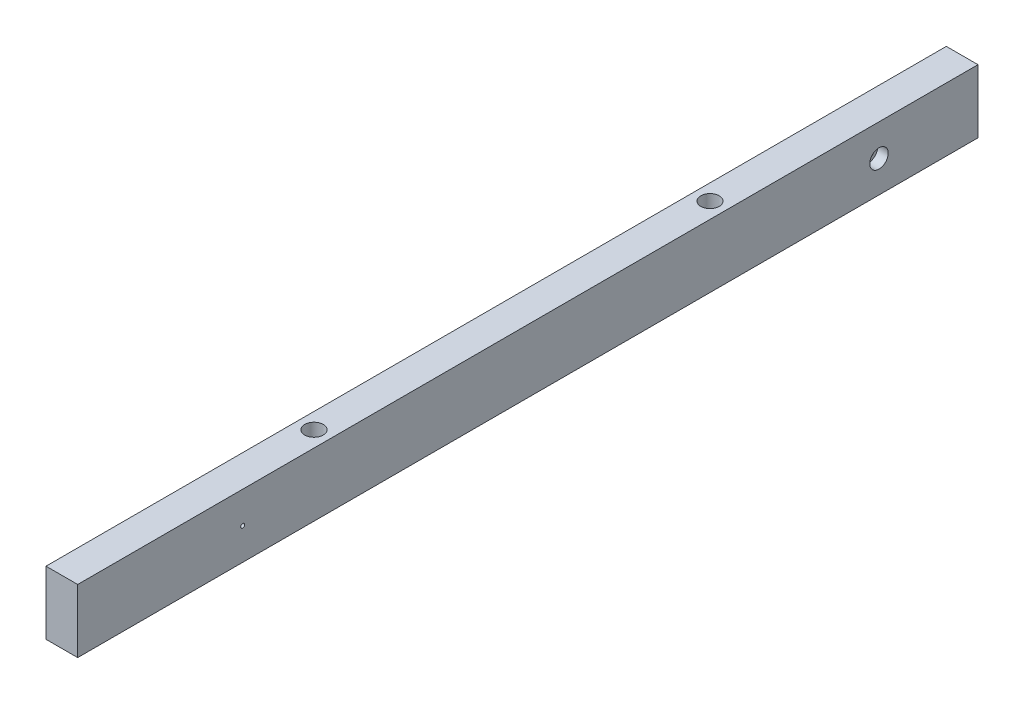
ISO-10303-21;
HEADER;
FILE_DESCRIPTION(('STEP AP214'),'2;1');
FILE_NAME('part.step','',(''),(''),'','','');
FILE_SCHEMA(('AUTOMOTIVE_DESIGN { 1 0 10303 214 1 1 1 1 }'));
ENDSEC;
DATA;
#1=APPLICATION_CONTEXT('core data for automotive mechanical design processes');
#2=APPLICATION_PROTOCOL_DEFINITION('international standard','automotive_design',2000,#1);
#3=PRODUCT_CONTEXT('',#1,'mechanical');
#4=PRODUCT('Part','Part','',(#3));
#5=PRODUCT_RELATED_PRODUCT_CATEGORY('part','',(#4));
#6=PRODUCT_DEFINITION_FORMATION('','',#4);
#7=PRODUCT_DEFINITION_CONTEXT('part definition',#1,'design');
#8=PRODUCT_DEFINITION('design','',#6,#7);
#9=PRODUCT_DEFINITION_SHAPE('','',#8);
#10=(LENGTH_UNIT() NAMED_UNIT(*) SI_UNIT(.MILLI.,.METRE.));
#11=(NAMED_UNIT(*) PLANE_ANGLE_UNIT() SI_UNIT($,.RADIAN.));
#12=(NAMED_UNIT(*) SI_UNIT($,.STERADIAN.) SOLID_ANGLE_UNIT());
#13=UNCERTAINTY_MEASURE_WITH_UNIT(LENGTH_MEASURE(1.E-05),#10,'distance_accuracy_value','');
#14=(GEOMETRIC_REPRESENTATION_CONTEXT(3) GLOBAL_UNCERTAINTY_ASSIGNED_CONTEXT((#13)) GLOBAL_UNIT_ASSIGNED_CONTEXT((#10,
#11,#12)) REPRESENTATION_CONTEXT('',''));
#15=CARTESIAN_POINT('',(0.,0.,0.));
#16=DIRECTION('',(0.,0.,1.));
#17=DIRECTION('',(1.,0.,0.));
#18=AXIS2_PLACEMENT_3D('',#15,#16,#17);
#19=CARTESIAN_POINT('',(12.,24.0000000000001,-150.));
#20=DIRECTION('',(0.,-1.,0.));
#21=DIRECTION('',(0.,0.,-1.));
#22=AXIS2_PLACEMENT_3D('',#19,#20,#21);
#23=CYLINDRICAL_SURFACE('',#22,4.5);
#24=CARTESIAN_POINT('',(12.,-14.,-150.));
#25=DIRECTION('',(0.,-1.,0.));
#26=DIRECTION('',(0.,0.,-1.));
#27=AXIS2_PLACEMENT_3D('',#24,#25,#26);
#28=CIRCLE('',#27,4.5);
#29=CARTESIAN_POINT('',(12.,-14.,-154.5));
#30=VERTEX_POINT('',#29);
#31=EDGE_CURVE('E111',#30,#30,#28,.F.);
#32=ORIENTED_EDGE('',*,*,#31,.F.);
#33=EDGE_LOOP('',(#32));
#34=FACE_BOUND('',#33,.T.);
#35=CARTESIAN_POINT('',(12.,14.0000000000001,-150.));
#36=DIRECTION('',(0.,1.,0.));
#37=DIRECTION('',(0.,0.,1.));
#38=AXIS2_PLACEMENT_3D('',#35,#36,#37);
#39=CIRCLE('',#38,4.5);
#40=CARTESIAN_POINT('',(12.,14.0000000000001,-145.5));
#41=VERTEX_POINT('',#40);
#42=EDGE_CURVE('E125',#41,#41,#39,.F.);
#43=ORIENTED_EDGE('',*,*,#42,.F.);
#44=EDGE_LOOP('',(#43));
#45=FACE_BOUND('',#44,.T.);
#46=ADVANCED_FACE('F41',(#34,#45),#23,.F.);
#47=CARTESIAN_POINT('',(12.,24.0000000000001,150.));
#48=DIRECTION('',(0.,-1.,0.));
#49=DIRECTION('',(0.,0.,-1.));
#50=AXIS2_PLACEMENT_3D('',#47,#48,#49);
#51=CYLINDRICAL_SURFACE('',#50,4.5);
#52=CARTESIAN_POINT('',(12.,-14.,150.));
#53=DIRECTION('',(0.,-1.,0.));
#54=DIRECTION('',(0.,0.,-1.));
#55=AXIS2_PLACEMENT_3D('',#52,#53,#54);
#56=CIRCLE('',#55,4.5);
#57=CARTESIAN_POINT('',(12.,-14.,145.5));
#58=VERTEX_POINT('',#57);
#59=EDGE_CURVE('E117',#58,#58,#56,.F.);
#60=ORIENTED_EDGE('',*,*,#59,.F.);
#61=EDGE_LOOP('',(#60));
#62=FACE_BOUND('',#61,.T.);
#63=CARTESIAN_POINT('',(12.,14.,150.));
#64=DIRECTION('',(0.,1.,0.));
#65=DIRECTION('',(0.,0.,1.));
#66=AXIS2_PLACEMENT_3D('',#63,#64,#65);
#67=CIRCLE('',#66,4.5);
#68=CARTESIAN_POINT('',(12.,14.,154.5));
#69=VERTEX_POINT('',#68);
#70=EDGE_CURVE('E123',#69,#69,#67,.F.);
#71=ORIENTED_EDGE('',*,*,#70,.F.);
#72=EDGE_LOOP('',(#71));
#73=FACE_BOUND('',#72,.T.);
#74=ADVANCED_FACE('F190',(#62,#73),#51,.F.);
#75=CARTESIAN_POINT('',(24.,24.0000000000001,-341.000000000001));
#76=DIRECTION('',(0.,-1.,0.));
#77=DIRECTION('',(0.,0.,-1.));
#78=AXIS2_PLACEMENT_3D('',#75,#76,#77);
#79=PLANE('',#78);
#80=CARTESIAN_POINT('',(12.,24.,150.));
#81=DIRECTION('',(0.,1.,0.));
#82=DIRECTION('',(0.,0.,1.));
#83=AXIS2_PLACEMENT_3D('',#80,#81,#82);
#84=CIRCLE('',#83,7.);
#85=CARTESIAN_POINT('',(12.,24.,157.));
#86=VERTEX_POINT('',#85);
#87=EDGE_CURVE('E151',#86,#86,#84,.T.);
#88=ORIENTED_EDGE('',*,*,#87,.F.);
#89=EDGE_LOOP('',(#88));
#90=FACE_BOUND('',#89,.T.);
#91=CARTESIAN_POINT('',(12.,24.0000000000001,-150.));
#92=DIRECTION('',(0.,1.,0.));
#93=DIRECTION('',(0.,0.,1.));
#94=AXIS2_PLACEMENT_3D('',#91,#92,#93);
#95=CIRCLE('',#94,7.);
#96=CARTESIAN_POINT('',(12.,24.0000000000001,-143.));
#97=VERTEX_POINT('',#96);
#98=EDGE_CURVE('E147',#97,#97,#95,.T.);
#99=ORIENTED_EDGE('',*,*,#98,.F.);
#100=EDGE_LOOP('',(#99));
#101=FACE_BOUND('',#100,.T.);
#102=DIRECTION('',(0.,0.,1.));
#103=VECTOR('',#102,1.);
#104=CARTESIAN_POINT('',(0.,24.0000000000001,-341.000000000001));
#105=LINE('',#104,#103);
#106=CARTESIAN_POINT('',(0.,24.0000000000001,-341.000000000001));
#107=VERTEX_POINT('',#106);
#108=CARTESIAN_POINT('',(0.,24.,340.999999999999));
#109=VERTEX_POINT('',#108);
#110=EDGE_CURVE('E108',#107,#109,#105,.T.);
#111=ORIENTED_EDGE('',*,*,#110,.T.);
#112=DIRECTION('',(-1.,0.,0.));
#113=VECTOR('',#112,1.);
#114=CARTESIAN_POINT('',(24.,24.,340.999999999999));
#115=LINE('',#114,#113);
#116=CARTESIAN_POINT('',(24.,24.,340.999999999999));
#117=VERTEX_POINT('',#116);
#118=EDGE_CURVE('E11',#117,#109,#115,.T.);
#119=ORIENTED_EDGE('',*,*,#118,.F.);
#120=DIRECTION('',(0.,0.,1.));
#121=VECTOR('',#120,1.);
#122=CARTESIAN_POINT('',(24.,24.0000000000001,-341.000000000001));
#123=LINE('',#122,#121);
#124=CARTESIAN_POINT('',(24.,24.0000000000001,-341.000000000001));
#125=VERTEX_POINT('',#124);
#126=EDGE_CURVE('E95',#125,#117,#123,.T.);
#127=ORIENTED_EDGE('',*,*,#126,.F.);
#128=DIRECTION('',(-1.,0.,0.));
#129=VECTOR('',#128,1.);
#130=CARTESIAN_POINT('',(24.,24.0000000000001,-341.000000000001));
#131=LINE('',#130,#129);
#132=EDGE_CURVE('E104',#125,#107,#131,.T.);
#133=ORIENTED_EDGE('',*,*,#132,.T.);
#134=EDGE_LOOP('',(#111,#119,#127,#133));
#135=FACE_BOUND('',#134,.T.);
#136=ADVANCED_FACE('F43',(#90,#101,#135),#79,.F.);
#137=CARTESIAN_POINT('',(24.,-24.,340.999999999999));
#138=DIRECTION('',(0.,0.,-1.));
#139=DIRECTION('',(-1.,0.,0.));
#140=AXIS2_PLACEMENT_3D('',#137,#138,#139);
#141=PLANE('',#140);
#142=DIRECTION('',(0.,-1.,0.));
#143=VECTOR('',#142,1.);
#144=CARTESIAN_POINT('',(0.,-24.,340.999999999999));
#145=LINE('',#144,#143);
#146=CARTESIAN_POINT('',(0.,-24.,340.999999999999));
#147=VERTEX_POINT('',#146);
#148=EDGE_CURVE('E99',#109,#147,#145,.T.);
#149=ORIENTED_EDGE('',*,*,#148,.T.);
#150=DIRECTION('',(-1.,0.,0.));
#151=VECTOR('',#150,1.);
#152=CARTESIAN_POINT('',(24.,-24.,340.999999999999));
#153=LINE('',#152,#151);
#154=CARTESIAN_POINT('',(24.,-24.,340.999999999999));
#155=VERTEX_POINT('',#154);
#156=EDGE_CURVE('E51',#155,#147,#153,.T.);
#157=ORIENTED_EDGE('',*,*,#156,.F.);
#158=DIRECTION('',(0.,-1.,0.));
#159=VECTOR('',#158,1.);
#160=CARTESIAN_POINT('',(24.,-24.,340.999999999999));
#161=LINE('',#160,#159);
#162=EDGE_CURVE('E90',#117,#155,#161,.T.);
#163=ORIENTED_EDGE('',*,*,#162,.F.);
#164=ORIENTED_EDGE('',*,*,#118,.T.);
#165=EDGE_LOOP('',(#149,#157,#163,#164));
#166=FACE_BOUND('',#165,.T.);
#167=ADVANCED_FACE('F98',(#166),#141,.F.);
#168=CARTESIAN_POINT('',(24.,-24.0000000000001,-341.000000000001));
#169=DIRECTION('',(0.,1.,0.));
#170=DIRECTION('',(0.,0.,1.));
#171=AXIS2_PLACEMENT_3D('',#168,#169,#170);
#172=PLANE('',#171);
#173=CARTESIAN_POINT('',(12.,-24.,150.));
#174=DIRECTION('',(0.,-1.,0.));
#175=DIRECTION('',(0.,0.,-1.));
#176=AXIS2_PLACEMENT_3D('',#173,#174,#175);
#177=CIRCLE('',#176,10.);
#178=CARTESIAN_POINT('',(12.,-24.,140.));
#179=VERTEX_POINT('',#178);
#180=EDGE_CURVE('E137',#179,#179,#177,.T.);
#181=ORIENTED_EDGE('',*,*,#180,.F.);
#182=EDGE_LOOP('',(#181));
#183=FACE_BOUND('',#182,.T.);
#184=CARTESIAN_POINT('',(12.,-24.0000000000001,-150.));
#185=DIRECTION('',(0.,-1.,0.));
#186=DIRECTION('',(0.,0.,-1.));
#187=AXIS2_PLACEMENT_3D('',#184,#185,#186);
#188=CIRCLE('',#187,10.);
#189=CARTESIAN_POINT('',(12.,-24.0000000000001,-160.));
#190=VERTEX_POINT('',#189);
#191=EDGE_CURVE('E132',#190,#190,#188,.T.);
#192=ORIENTED_EDGE('',*,*,#191,.F.);
#193=EDGE_LOOP('',(#192));
#194=FACE_BOUND('',#193,.T.);
#195=DIRECTION('',(0.,0.,-1.));
#196=VECTOR('',#195,1.);
#197=CARTESIAN_POINT('',(0.,-24.0000000000001,-341.000000000001));
#198=LINE('',#197,#196);
#199=CARTESIAN_POINT('',(0.,-24.0000000000001,-341.000000000001));
#200=VERTEX_POINT('',#199);
#201=EDGE_CURVE('E77',#147,#200,#198,.T.);
#202=ORIENTED_EDGE('',*,*,#201,.T.);
#203=DIRECTION('',(-1.,0.,0.));
#204=VECTOR('',#203,1.);
#205=CARTESIAN_POINT('',(24.,-24.0000000000001,-341.000000000001));
#206=LINE('',#205,#204);
#207=CARTESIAN_POINT('',(24.,-24.0000000000001,-341.000000000001));
#208=VERTEX_POINT('',#207);
#209=EDGE_CURVE('E100',#208,#200,#206,.T.);
#210=ORIENTED_EDGE('',*,*,#209,.F.);
#211=DIRECTION('',(0.,0.,-1.));
#212=VECTOR('',#211,1.);
#213=CARTESIAN_POINT('',(24.,-24.0000000000001,-341.000000000001));
#214=LINE('',#213,#212);
#215=EDGE_CURVE('E93',#155,#208,#214,.T.);
#216=ORIENTED_EDGE('',*,*,#215,.F.);
#217=ORIENTED_EDGE('',*,*,#156,.T.);
#218=EDGE_LOOP('',(#202,#210,#216,#217));
#219=FACE_BOUND('',#218,.T.);
#220=ADVANCED_FACE('F102',(#183,#194,#219),#172,.F.);
#221=CARTESIAN_POINT('',(24.,-24.0000000000001,-341.000000000001));
#222=DIRECTION('',(0.,0.,1.));
#223=DIRECTION('',(1.,0.,0.));
#224=AXIS2_PLACEMENT_3D('',#221,#222,#223);
#225=PLANE('',#224);
#226=DIRECTION('',(0.,1.,0.));
#227=VECTOR('',#226,1.);
#228=CARTESIAN_POINT('',(0.,-24.0000000000001,-341.000000000001));
#229=LINE('',#228,#227);
#230=EDGE_CURVE('E83',#200,#107,#229,.T.);
#231=ORIENTED_EDGE('',*,*,#230,.T.);
#232=ORIENTED_EDGE('',*,*,#132,.F.);
#233=DIRECTION('',(0.,1.,0.));
#234=VECTOR('',#233,1.);
#235=CARTESIAN_POINT('',(24.,-24.0000000000001,-341.000000000001));
#236=LINE('',#235,#234);
#237=EDGE_CURVE('E60',#208,#125,#236,.T.);
#238=ORIENTED_EDGE('',*,*,#237,.F.);
#239=ORIENTED_EDGE('',*,*,#209,.T.);
#240=EDGE_LOOP('',(#231,#232,#238,#239));
#241=FACE_BOUND('',#240,.T.);
#242=ADVANCED_FACE('F206',(#241),#225,.F.);
#243=CARTESIAN_POINT('',(24.,0.,0.));
#244=DIRECTION('',(-1.,0.,0.));
#245=DIRECTION('',(0.,0.,1.));
#246=AXIS2_PLACEMENT_3D('',#243,#244,#245);
#247=PLANE('',#246);
#248=CARTESIAN_POINT('',(24.,0.,-266.000000000001));
#249=DIRECTION('',(-1.,0.,0.));
#250=DIRECTION('',(0.,0.,1.));
#251=AXIS2_PLACEMENT_3D('',#248,#249,#250);
#252=CIRCLE('',#251,6.99999999999999);
#253=CARTESIAN_POINT('',(24.,0.,-259.000000000001));
#254=VERTEX_POINT('',#253);
#255=EDGE_CURVE('E164',#254,#254,#252,.T.);
#256=ORIENTED_EDGE('',*,*,#255,.T.);
#257=EDGE_LOOP('',(#256));
#258=FACE_BOUND('',#257,.T.);
#259=CARTESIAN_POINT('',(24.,0.,215.999999999999));
#260=DIRECTION('',(1.,0.,0.));
#261=DIRECTION('',(0.,0.,-1.));
#262=AXIS2_PLACEMENT_3D('',#259,#260,#261);
#263=CIRCLE('',#262,1.50000000000003);
#264=CARTESIAN_POINT('',(24.,0.,214.499999999999));
#265=VERTEX_POINT('',#264);
#266=EDGE_CURVE('E156',#265,#265,#263,.T.);
#267=ORIENTED_EDGE('',*,*,#266,.F.);
#268=EDGE_LOOP('',(#267));
#269=FACE_BOUND('',#268,.T.);
#270=ORIENTED_EDGE('',*,*,#126,.T.);
#271=ORIENTED_EDGE('',*,*,#162,.T.);
#272=ORIENTED_EDGE('',*,*,#215,.T.);
#273=ORIENTED_EDGE('',*,*,#237,.T.);
#274=EDGE_LOOP('',(#270,#271,#272,#273));
#275=FACE_BOUND('',#274,.T.);
#276=ADVANCED_FACE('F91',(#258,#269,#275),#247,.F.);
#277=CARTESIAN_POINT('',(0.,0.,0.));
#278=DIRECTION('',(-1.,0.,0.));
#279=DIRECTION('',(0.,0.,1.));
#280=AXIS2_PLACEMENT_3D('',#277,#278,#279);
#281=PLANE('',#280);
#282=CARTESIAN_POINT('',(0.,0.,-266.000000000001));
#283=DIRECTION('',(-1.,0.,0.));
#284=DIRECTION('',(0.,0.,1.));
#285=AXIS2_PLACEMENT_3D('',#282,#283,#284);
#286=CIRCLE('',#285,4.50000000000002);
#287=CARTESIAN_POINT('',(0.,0.,-261.500000000001));
#288=VERTEX_POINT('',#287);
#289=EDGE_CURVE('E159',#288,#288,#286,.T.);
#290=ORIENTED_EDGE('',*,*,#289,.F.);
#291=EDGE_LOOP('',(#290));
#292=FACE_BOUND('',#291,.T.);
#293=CARTESIAN_POINT('',(0.,0.,215.999999999999));
#294=DIRECTION('',(1.,0.,0.));
#295=DIRECTION('',(0.,0.,-1.));
#296=AXIS2_PLACEMENT_3D('',#293,#294,#295);
#297=CIRCLE('',#296,1.50000000000003);
#298=CARTESIAN_POINT('',(0.,0.,214.499999999999));
#299=VERTEX_POINT('',#298);
#300=EDGE_CURVE('E148',#299,#299,#297,.T.);
#301=ORIENTED_EDGE('',*,*,#300,.T.);
#302=EDGE_LOOP('',(#301));
#303=FACE_BOUND('',#302,.T.);
#304=ORIENTED_EDGE('',*,*,#110,.F.);
#305=ORIENTED_EDGE('',*,*,#230,.F.);
#306=ORIENTED_EDGE('',*,*,#201,.F.);
#307=ORIENTED_EDGE('',*,*,#148,.F.);
#308=EDGE_LOOP('',(#304,#305,#306,#307));
#309=FACE_BOUND('',#308,.T.);
#310=ADVANCED_FACE('F205',(#292,#303,#309),#281,.T.);
#311=CARTESIAN_POINT('',(12.,-14.,150.));
#312=DIRECTION('',(0.,-1.,0.));
#313=DIRECTION('',(0.,0.,-1.));
#314=AXIS2_PLACEMENT_3D('',#311,#312,#313);
#315=PLANE('',#314);
#316=CARTESIAN_POINT('',(12.,-14.,150.));
#317=DIRECTION('',(0.,-1.,0.));
#318=DIRECTION('',(0.,0.,-1.));
#319=AXIS2_PLACEMENT_3D('',#316,#317,#318);
#320=CIRCLE('',#319,10.);
#321=CARTESIAN_POINT('',(12.,-14.,140.));
#322=VERTEX_POINT('',#321);
#323=EDGE_CURVE('E120',#322,#322,#320,.T.);
#324=ORIENTED_EDGE('',*,*,#323,.T.);
#325=EDGE_LOOP('',(#324));
#326=FACE_BOUND('',#325,.T.);
#327=ORIENTED_EDGE('',*,*,#59,.T.);
#328=EDGE_LOOP('',(#327));
#329=FACE_BOUND('',#328,.T.);
#330=ADVANCED_FACE('F210',(#326,#329),#315,.T.);
#331=CARTESIAN_POINT('',(12.,-14.,150.));
#332=DIRECTION('',(0.,-1.,0.));
#333=DIRECTION('',(0.,0.,-1.));
#334=AXIS2_PLACEMENT_3D('',#331,#332,#333);
#335=CYLINDRICAL_SURFACE('',#334,10.);
#336=ORIENTED_EDGE('',*,*,#323,.F.);
#337=EDGE_LOOP('',(#336));
#338=FACE_BOUND('',#337,.T.);
#339=ORIENTED_EDGE('',*,*,#180,.T.);
#340=EDGE_LOOP('',(#339));
#341=FACE_BOUND('',#340,.T.);
#342=ADVANCED_FACE('F251',(#338,#341),#335,.F.);
#343=CARTESIAN_POINT('',(12.,-14.0000000000001,-150.));
#344=DIRECTION('',(0.,-1.,0.));
#345=DIRECTION('',(0.,0.,-1.));
#346=AXIS2_PLACEMENT_3D('',#343,#344,#345);
#347=PLANE('',#346);
#348=CARTESIAN_POINT('',(12.,-14.0000000000001,-150.));
#349=DIRECTION('',(0.,-1.,0.));
#350=DIRECTION('',(0.,0.,-1.));
#351=AXIS2_PLACEMENT_3D('',#348,#349,#350);
#352=CIRCLE('',#351,10.);
#353=CARTESIAN_POINT('',(12.,-14.0000000000001,-160.));
#354=VERTEX_POINT('',#353);
#355=EDGE_CURVE('E128',#354,#354,#352,.T.);
#356=ORIENTED_EDGE('',*,*,#355,.T.);
#357=EDGE_LOOP('',(#356));
#358=FACE_BOUND('',#357,.T.);
#359=ORIENTED_EDGE('',*,*,#31,.T.);
#360=EDGE_LOOP('',(#359));
#361=FACE_BOUND('',#360,.T.);
#362=ADVANCED_FACE('F255',(#358,#361),#347,.T.);
#363=CARTESIAN_POINT('',(12.,-14.0000000000001,-150.));
#364=DIRECTION('',(0.,-1.,0.));
#365=DIRECTION('',(0.,0.,-1.));
#366=AXIS2_PLACEMENT_3D('',#363,#364,#365);
#367=CYLINDRICAL_SURFACE('',#366,10.);
#368=ORIENTED_EDGE('',*,*,#355,.F.);
#369=EDGE_LOOP('',(#368));
#370=FACE_BOUND('',#369,.T.);
#371=ORIENTED_EDGE('',*,*,#191,.T.);
#372=EDGE_LOOP('',(#371));
#373=FACE_BOUND('',#372,.T.);
#374=ADVANCED_FACE('F243',(#370,#373),#367,.F.);
#375=CARTESIAN_POINT('',(12.,14.0000000000001,-150.));
#376=DIRECTION('',(0.,1.,0.));
#377=DIRECTION('',(0.,0.,1.));
#378=AXIS2_PLACEMENT_3D('',#375,#376,#377);
#379=PLANE('',#378);
#380=CARTESIAN_POINT('',(12.,14.0000000000001,-150.));
#381=DIRECTION('',(0.,1.,0.));
#382=DIRECTION('',(0.,0.,1.));
#383=AXIS2_PLACEMENT_3D('',#380,#381,#382);
#384=CIRCLE('',#383,7.);
#385=CARTESIAN_POINT('',(12.,14.0000000000001,-143.));
#386=VERTEX_POINT('',#385);
#387=EDGE_CURVE('E144',#386,#386,#384,.T.);
#388=ORIENTED_EDGE('',*,*,#387,.T.);
#389=EDGE_LOOP('',(#388));
#390=FACE_BOUND('',#389,.T.);
#391=ORIENTED_EDGE('',*,*,#42,.T.);
#392=EDGE_LOOP('',(#391));
#393=FACE_BOUND('',#392,.T.);
#394=ADVANCED_FACE('F234',(#390,#393),#379,.T.);
#395=CARTESIAN_POINT('',(12.,14.0000000000001,-150.));
#396=DIRECTION('',(0.,1.,0.));
#397=DIRECTION('',(0.,0.,1.));
#398=AXIS2_PLACEMENT_3D('',#395,#396,#397);
#399=CYLINDRICAL_SURFACE('',#398,7.);
#400=ORIENTED_EDGE('',*,*,#387,.F.);
#401=EDGE_LOOP('',(#400));
#402=FACE_BOUND('',#401,.T.);
#403=ORIENTED_EDGE('',*,*,#98,.T.);
#404=EDGE_LOOP('',(#403));
#405=FACE_BOUND('',#404,.T.);
#406=ADVANCED_FACE('F231',(#402,#405),#399,.F.);
#407=CARTESIAN_POINT('',(12.,14.,150.));
#408=DIRECTION('',(0.,1.,0.));
#409=DIRECTION('',(0.,0.,1.));
#410=AXIS2_PLACEMENT_3D('',#407,#408,#409);
#411=PLANE('',#410);
#412=CARTESIAN_POINT('',(12.,14.,150.));
#413=DIRECTION('',(0.,1.,0.));
#414=DIRECTION('',(0.,0.,1.));
#415=AXIS2_PLACEMENT_3D('',#412,#413,#414);
#416=CIRCLE('',#415,7.);
#417=CARTESIAN_POINT('',(12.,14.,157.));
#418=VERTEX_POINT('',#417);
#419=EDGE_CURVE('E126',#418,#418,#416,.T.);
#420=ORIENTED_EDGE('',*,*,#419,.T.);
#421=EDGE_LOOP('',(#420));
#422=FACE_BOUND('',#421,.T.);
#423=ORIENTED_EDGE('',*,*,#70,.T.);
#424=EDGE_LOOP('',(#423));
#425=FACE_BOUND('',#424,.T.);
#426=ADVANCED_FACE('F233',(#422,#425),#411,.T.);
#427=CARTESIAN_POINT('',(12.,14.,150.));
#428=DIRECTION('',(0.,1.,0.));
#429=DIRECTION('',(0.,0.,1.));
#430=AXIS2_PLACEMENT_3D('',#427,#428,#429);
#431=CYLINDRICAL_SURFACE('',#430,7.);
#432=ORIENTED_EDGE('',*,*,#419,.F.);
#433=EDGE_LOOP('',(#432));
#434=FACE_BOUND('',#433,.T.);
#435=ORIENTED_EDGE('',*,*,#87,.T.);
#436=EDGE_LOOP('',(#435));
#437=FACE_BOUND('',#436,.T.);
#438=ADVANCED_FACE('F240',(#434,#437),#431,.F.);
#439=CARTESIAN_POINT('',(0.,0.,215.999999999999));
#440=DIRECTION('',(1.,0.,0.));
#441=DIRECTION('',(0.,0.,-1.));
#442=AXIS2_PLACEMENT_3D('',#439,#440,#441);
#443=CYLINDRICAL_SURFACE('',#442,1.50000000000003);
#444=ORIENTED_EDGE('',*,*,#300,.F.);
#445=EDGE_LOOP('',(#444));
#446=FACE_BOUND('',#445,.T.);
#447=ORIENTED_EDGE('',*,*,#266,.T.);
#448=EDGE_LOOP('',(#447));
#449=FACE_BOUND('',#448,.T.);
#450=ADVANCED_FACE('F187',(#446,#449),#443,.F.);
#451=CARTESIAN_POINT('',(24.,0.,-266.000000000001));
#452=DIRECTION('',(-1.,0.,0.));
#453=DIRECTION('',(0.,0.,1.));
#454=AXIS2_PLACEMENT_3D('',#451,#452,#453);
#455=CYLINDRICAL_SURFACE('',#454,4.50000000000002);
#456=CARTESIAN_POINT('',(16.,0.,-266.000000000001));
#457=DIRECTION('',(-1.,0.,0.));
#458=DIRECTION('',(0.,0.,1.));
#459=AXIS2_PLACEMENT_3D('',#456,#457,#458);
#460=CIRCLE('',#459,4.50000000000002);
#461=CARTESIAN_POINT('',(16.,0.,-261.500000000001));
#462=VERTEX_POINT('',#461);
#463=EDGE_CURVE('E45',#462,#462,#460,.F.);
#464=ORIENTED_EDGE('',*,*,#463,.T.);
#465=EDGE_LOOP('',(#464));
#466=FACE_BOUND('',#465,.T.);
#467=ORIENTED_EDGE('',*,*,#289,.T.);
#468=EDGE_LOOP('',(#467));
#469=FACE_BOUND('',#468,.T.);
#470=ADVANCED_FACE('F174',(#466,#469),#455,.F.);
#471=CARTESIAN_POINT('',(16.,0.,-266.000000000001));
#472=DIRECTION('',(-1.,0.,0.));
#473=DIRECTION('',(0.,0.,1.));
#474=AXIS2_PLACEMENT_3D('',#471,#472,#473);
#475=PLANE('',#474);
#476=CARTESIAN_POINT('',(16.,0.,-266.000000000001));
#477=DIRECTION('',(-1.,0.,0.));
#478=DIRECTION('',(0.,0.,1.));
#479=AXIS2_PLACEMENT_3D('',#476,#477,#478);
#480=CIRCLE('',#479,6.99999999999999);
#481=CARTESIAN_POINT('',(16.,0.,-259.000000000001));
#482=VERTEX_POINT('',#481);
#483=EDGE_CURVE('E167',#482,#482,#480,.T.);
#484=ORIENTED_EDGE('',*,*,#483,.F.);
#485=EDGE_LOOP('',(#484));
#486=FACE_BOUND('',#485,.T.);
#487=ORIENTED_EDGE('',*,*,#463,.F.);
#488=EDGE_LOOP('',(#487));
#489=FACE_BOUND('',#488,.T.);
#490=ADVANCED_FACE('F177',(#486,#489),#475,.F.);
#491=CARTESIAN_POINT('',(16.,0.,-266.000000000001));
#492=DIRECTION('',(1.,0.,0.));
#493=DIRECTION('',(0.,0.,-1.));
#494=AXIS2_PLACEMENT_3D('',#491,#492,#493);
#495=CYLINDRICAL_SURFACE('',#494,6.99999999999999);
#496=ORIENTED_EDGE('',*,*,#483,.T.);
#497=EDGE_LOOP('',(#496));
#498=FACE_BOUND('',#497,.T.);
#499=ORIENTED_EDGE('',*,*,#255,.F.);
#500=EDGE_LOOP('',(#499));
#501=FACE_BOUND('',#500,.T.);
#502=ADVANCED_FACE('F179',(#498,#501),#495,.F.);
#503=CLOSED_SHELL('',(#46,#74,#136,#167,#220,#242,#276,#310,#330,#342,#362,#374,#394,#406,#426,
#438,#450,#470,#490,#502));
#504=MANIFOLD_SOLID_BREP('B2',#503);
#505=ADVANCED_BREP_SHAPE_REPRESENTATION('',(#18,#504),#14);
#506=SHAPE_DEFINITION_REPRESENTATION(#9,#505);
ENDSEC;
END-ISO-10303-21;
